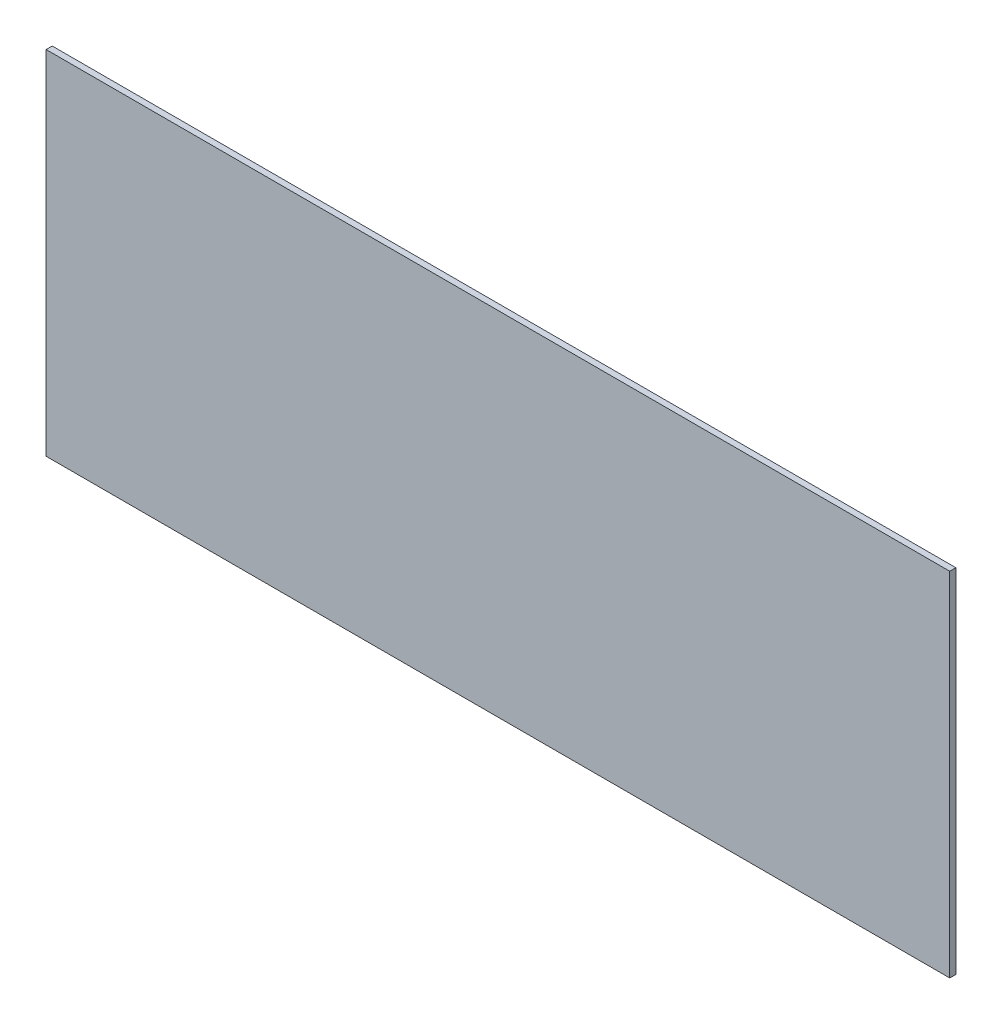
ISO-10303-21;
HEADER;
FILE_DESCRIPTION(('STEP AP214'),'2;1');
FILE_NAME('part.step','',(''),(''),'','','');
FILE_SCHEMA(('AUTOMOTIVE_DESIGN { 1 0 10303 214 1 1 1 1 }'));
ENDSEC;
DATA;
#1=APPLICATION_CONTEXT('core data for automotive mechanical design processes');
#2=APPLICATION_PROTOCOL_DEFINITION('international standard','automotive_design',2000,#1);
#3=PRODUCT_CONTEXT('',#1,'mechanical');
#4=PRODUCT('Part','Part','',(#3));
#5=PRODUCT_RELATED_PRODUCT_CATEGORY('part','',(#4));
#6=PRODUCT_DEFINITION_FORMATION('','',#4);
#7=PRODUCT_DEFINITION_CONTEXT('part definition',#1,'design');
#8=PRODUCT_DEFINITION('design','',#6,#7);
#9=PRODUCT_DEFINITION_SHAPE('','',#8);
#10=(LENGTH_UNIT() NAMED_UNIT(*) SI_UNIT(.MILLI.,.METRE.));
#11=(NAMED_UNIT(*) PLANE_ANGLE_UNIT() SI_UNIT($,.RADIAN.));
#12=(NAMED_UNIT(*) SI_UNIT($,.STERADIAN.) SOLID_ANGLE_UNIT());
#13=UNCERTAINTY_MEASURE_WITH_UNIT(LENGTH_MEASURE(1.E-05),#10,'distance_accuracy_value','');
#14=(GEOMETRIC_REPRESENTATION_CONTEXT(3) GLOBAL_UNCERTAINTY_ASSIGNED_CONTEXT((#13)) GLOBAL_UNIT_ASSIGNED_CONTEXT((#10,
#11,#12)) REPRESENTATION_CONTEXT('',''));
#15=CARTESIAN_POINT('',(0.,0.,0.));
#16=DIRECTION('',(0.,0.,1.));
#17=DIRECTION('',(1.,0.,0.));
#18=AXIS2_PLACEMENT_3D('',#15,#16,#17);
#19=CARTESIAN_POINT('',(25.,25.,26.));
#20=DIRECTION('',(1.,0.,0.));
#21=DIRECTION('',(0.,0.,-1.));
#22=AXIS2_PLACEMENT_3D('',#19,#20,#21);
#23=PLANE('',#22);
#24=DIRECTION('',(0.,-1.,0.));
#25=VECTOR('',#24,1.);
#26=CARTESIAN_POINT('',(25.,25.,22.));
#27=LINE('',#26,#25);
#28=CARTESIAN_POINT('',(25.,255.,22.));
#29=VERTEX_POINT('',#28);
#30=CARTESIAN_POINT('',(25.,25.,22.));
#31=VERTEX_POINT('',#30);
#32=EDGE_CURVE('E102',#29,#31,#27,.T.);
#33=ORIENTED_EDGE('',*,*,#32,.T.);
#34=DIRECTION('',(0.,0.,-1.));
#35=VECTOR('',#34,1.);
#36=CARTESIAN_POINT('',(25.,25.,26.));
#37=LINE('',#36,#35);
#38=CARTESIAN_POINT('',(25.,25.,26.));
#39=VERTEX_POINT('',#38);
#40=EDGE_CURVE('E11',#39,#31,#37,.T.);
#41=ORIENTED_EDGE('',*,*,#40,.F.);
#42=DIRECTION('',(0.,-1.,0.));
#43=VECTOR('',#42,1.);
#44=CARTESIAN_POINT('',(25.,25.,26.));
#45=LINE('',#44,#43);
#46=CARTESIAN_POINT('',(25.,255.,26.));
#47=VERTEX_POINT('',#46);
#48=EDGE_CURVE('E90',#47,#39,#45,.T.);
#49=ORIENTED_EDGE('',*,*,#48,.F.);
#50=DIRECTION('',(0.,0.,-1.));
#51=VECTOR('',#50,1.);
#52=CARTESIAN_POINT('',(25.,255.,26.));
#53=LINE('',#52,#51);
#54=EDGE_CURVE('E98',#47,#29,#53,.T.);
#55=ORIENTED_EDGE('',*,*,#54,.T.);
#56=EDGE_LOOP('',(#33,#41,#49,#55));
#57=FACE_BOUND('',#56,.T.);
#58=ADVANCED_FACE('F39',(#57),#23,.F.);
#59=CARTESIAN_POINT('',(25.,25.,26.));
#60=DIRECTION('',(0.,1.,0.));
#61=DIRECTION('',(0.,0.,1.));
#62=AXIS2_PLACEMENT_3D('',#59,#60,#61);
#63=PLANE('',#62);
#64=DIRECTION('',(1.,0.,0.));
#65=VECTOR('',#64,1.);
#66=CARTESIAN_POINT('',(25.,25.,22.));
#67=LINE('',#66,#65);
#68=CARTESIAN_POINT('',(615.,25.,22.));
#69=VERTEX_POINT('',#68);
#70=EDGE_CURVE('E94',#31,#69,#67,.T.);
#71=ORIENTED_EDGE('',*,*,#70,.T.);
#72=DIRECTION('',(0.,0.,-1.));
#73=VECTOR('',#72,1.);
#74=CARTESIAN_POINT('',(615.,25.,26.));
#75=LINE('',#74,#73);
#76=CARTESIAN_POINT('',(615.,25.,26.));
#77=VERTEX_POINT('',#76);
#78=EDGE_CURVE('E47',#77,#69,#75,.T.);
#79=ORIENTED_EDGE('',*,*,#78,.F.);
#80=DIRECTION('',(1.,0.,0.));
#81=VECTOR('',#80,1.);
#82=CARTESIAN_POINT('',(25.,25.,26.));
#83=LINE('',#82,#81);
#84=EDGE_CURVE('E85',#39,#77,#83,.T.);
#85=ORIENTED_EDGE('',*,*,#84,.F.);
#86=ORIENTED_EDGE('',*,*,#40,.T.);
#87=EDGE_LOOP('',(#71,#79,#85,#86));
#88=FACE_BOUND('',#87,.T.);
#89=ADVANCED_FACE('F93',(#88),#63,.F.);
#90=CARTESIAN_POINT('',(615.,25.,26.));
#91=DIRECTION('',(-1.,0.,0.));
#92=DIRECTION('',(0.,0.,1.));
#93=AXIS2_PLACEMENT_3D('',#90,#91,#92);
#94=PLANE('',#93);
#95=DIRECTION('',(0.,1.,0.));
#96=VECTOR('',#95,1.);
#97=CARTESIAN_POINT('',(615.,25.,22.));
#98=LINE('',#97,#96);
#99=CARTESIAN_POINT('',(615.,255.,22.));
#100=VERTEX_POINT('',#99);
#101=EDGE_CURVE('E72',#69,#100,#98,.T.);
#102=ORIENTED_EDGE('',*,*,#101,.T.);
#103=DIRECTION('',(0.,0.,-1.));
#104=VECTOR('',#103,1.);
#105=CARTESIAN_POINT('',(615.,255.,26.));
#106=LINE('',#105,#104);
#107=CARTESIAN_POINT('',(615.,255.,26.));
#108=VERTEX_POINT('',#107);
#109=EDGE_CURVE('E95',#108,#100,#106,.T.);
#110=ORIENTED_EDGE('',*,*,#109,.F.);
#111=DIRECTION('',(0.,1.,0.));
#112=VECTOR('',#111,1.);
#113=CARTESIAN_POINT('',(615.,25.,26.));
#114=LINE('',#113,#112);
#115=EDGE_CURVE('E88',#77,#108,#114,.T.);
#116=ORIENTED_EDGE('',*,*,#115,.F.);
#117=ORIENTED_EDGE('',*,*,#78,.T.);
#118=EDGE_LOOP('',(#102,#110,#116,#117));
#119=FACE_BOUND('',#118,.T.);
#120=ADVANCED_FACE('F96',(#119),#94,.F.);
#121=CARTESIAN_POINT('',(25.,255.,26.));
#122=DIRECTION('',(0.,-1.,0.));
#123=DIRECTION('',(0.,0.,-1.));
#124=AXIS2_PLACEMENT_3D('',#121,#122,#123);
#125=PLANE('',#124);
#126=DIRECTION('',(-1.,0.,0.));
#127=VECTOR('',#126,1.);
#128=CARTESIAN_POINT('',(25.,255.,22.));
#129=LINE('',#128,#127);
#130=EDGE_CURVE('E78',#100,#29,#129,.T.);
#131=ORIENTED_EDGE('',*,*,#130,.T.);
#132=ORIENTED_EDGE('',*,*,#54,.F.);
#133=DIRECTION('',(-1.,0.,0.));
#134=VECTOR('',#133,1.);
#135=CARTESIAN_POINT('',(25.,255.,26.));
#136=LINE('',#135,#134);
#137=EDGE_CURVE('E55',#108,#47,#136,.T.);
#138=ORIENTED_EDGE('',*,*,#137,.F.);
#139=ORIENTED_EDGE('',*,*,#109,.T.);
#140=EDGE_LOOP('',(#131,#132,#138,#139));
#141=FACE_BOUND('',#140,.T.);
#142=ADVANCED_FACE('F109',(#141),#125,.F.);
#143=CARTESIAN_POINT('',(0.,0.,26.));
#144=DIRECTION('',(0.,0.,-1.));
#145=DIRECTION('',(-1.,0.,0.));
#146=AXIS2_PLACEMENT_3D('',#143,#144,#145);
#147=PLANE('',#146);
#148=ORIENTED_EDGE('',*,*,#48,.T.);
#149=ORIENTED_EDGE('',*,*,#84,.T.);
#150=ORIENTED_EDGE('',*,*,#115,.T.);
#151=ORIENTED_EDGE('',*,*,#137,.T.);
#152=EDGE_LOOP('',(#148,#149,#150,#151));
#153=FACE_BOUND('',#152,.T.);
#154=ADVANCED_FACE('F86',(#153),#147,.F.);
#155=CARTESIAN_POINT('',(0.,0.,22.));
#156=DIRECTION('',(0.,0.,-1.));
#157=DIRECTION('',(-1.,0.,0.));
#158=AXIS2_PLACEMENT_3D('',#155,#156,#157);
#159=PLANE('',#158);
#160=ORIENTED_EDGE('',*,*,#32,.F.);
#161=ORIENTED_EDGE('',*,*,#130,.F.);
#162=ORIENTED_EDGE('',*,*,#101,.F.);
#163=ORIENTED_EDGE('',*,*,#70,.F.);
#164=EDGE_LOOP('',(#160,#161,#162,#163));
#165=FACE_BOUND('',#164,.T.);
#166=ADVANCED_FACE('F112',(#165),#159,.T.);
#167=CLOSED_SHELL('',(#58,#89,#120,#142,#154,#166));
#168=MANIFOLD_SOLID_BREP('B2',#167);
#169=ADVANCED_BREP_SHAPE_REPRESENTATION('',(#18,#168),#14);
#170=SHAPE_DEFINITION_REPRESENTATION(#9,#169);
ENDSEC;
END-ISO-10303-21;
